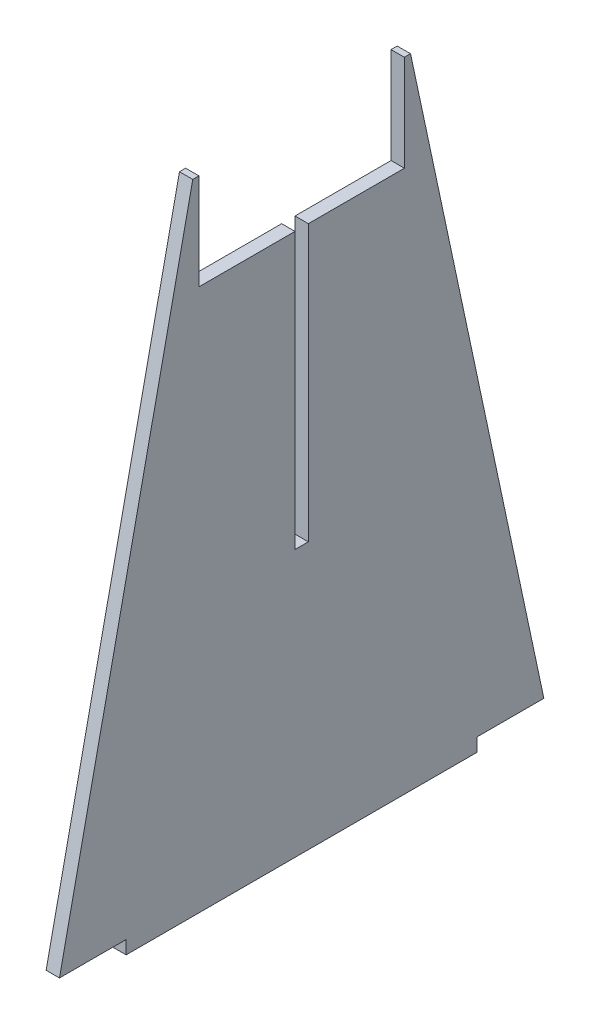
ISO-10303-21;
HEADER;
FILE_DESCRIPTION(('STEP AP214'),'2;1');
FILE_NAME('part.step','',(''),(''),'','','');
FILE_SCHEMA(('AUTOMOTIVE_DESIGN { 1 0 10303 214 1 1 1 1 }'));
ENDSEC;
DATA;
#1=APPLICATION_CONTEXT('core data for automotive mechanical design processes');
#2=APPLICATION_PROTOCOL_DEFINITION('international standard','automotive_design',2000,#1);
#3=PRODUCT_CONTEXT('',#1,'mechanical');
#4=PRODUCT('Part','Part','',(#3));
#5=PRODUCT_RELATED_PRODUCT_CATEGORY('part','',(#4));
#6=PRODUCT_DEFINITION_FORMATION('','',#4);
#7=PRODUCT_DEFINITION_CONTEXT('part definition',#1,'design');
#8=PRODUCT_DEFINITION('design','',#6,#7);
#9=PRODUCT_DEFINITION_SHAPE('','',#8);
#10=(LENGTH_UNIT() NAMED_UNIT(*) SI_UNIT(.MILLI.,.METRE.));
#11=(NAMED_UNIT(*) PLANE_ANGLE_UNIT() SI_UNIT($,.RADIAN.));
#12=(NAMED_UNIT(*) SI_UNIT($,.STERADIAN.) SOLID_ANGLE_UNIT());
#13=UNCERTAINTY_MEASURE_WITH_UNIT(LENGTH_MEASURE(1.E-05),#10,'distance_accuracy_value','');
#14=(GEOMETRIC_REPRESENTATION_CONTEXT(3) GLOBAL_UNCERTAINTY_ASSIGNED_CONTEXT((#13)) GLOBAL_UNIT_ASSIGNED_CONTEXT((#10,
#11,#12)) REPRESENTATION_CONTEXT('',''));
#15=CARTESIAN_POINT('',(0.,0.,0.));
#16=DIRECTION('',(0.,0.,1.));
#17=DIRECTION('',(1.,0.,0.));
#18=AXIS2_PLACEMENT_3D('',#15,#16,#17);
#19=CARTESIAN_POINT('',(3.,119.,1.5));
#20=DIRECTION('',(0.,-1.,0.));
#21=DIRECTION('',(0.,0.,-1.));
#22=AXIS2_PLACEMENT_3D('',#19,#20,#21);
#23=PLANE('',#22);
#24=DIRECTION('',(1.,0.,0.));
#25=VECTOR('',#24,1.);
#26=CARTESIAN_POINT('',(-22.4419389759441,119.,23.1133333333333));
#27=LINE('',#26,#25);
#28=CARTESIAN_POINT('',(0.,119.,23.1133333333333));
#29=VERTEX_POINT('',#28);
#30=CARTESIAN_POINT('',(3.,119.,23.1133333333333));
#31=VERTEX_POINT('',#30);
#32=EDGE_CURVE('E66',#29,#31,#27,.T.);
#33=ORIENTED_EDGE('',*,*,#32,.T.);
#34=DIRECTION('',(0.,0.,1.));
#35=VECTOR('',#34,1.);
#36=CARTESIAN_POINT('',(3.,119.,1.5));
#37=LINE('',#36,#35);
#38=CARTESIAN_POINT('',(3.,119.,1.5));
#39=VERTEX_POINT('',#38);
#40=EDGE_CURVE('E222',#39,#31,#37,.T.);
#41=ORIENTED_EDGE('',*,*,#40,.F.);
#42=DIRECTION('',(-1.,0.,0.));
#43=VECTOR('',#42,1.);
#44=CARTESIAN_POINT('',(3.,119.,1.5));
#45=LINE('',#44,#43);
#46=CARTESIAN_POINT('',(0.,119.,1.5));
#47=VERTEX_POINT('',#46);
#48=EDGE_CURVE('E268',#39,#47,#45,.T.);
#49=ORIENTED_EDGE('',*,*,#48,.T.);
#50=DIRECTION('',(0.,0.,1.));
#51=VECTOR('',#50,1.);
#52=CARTESIAN_POINT('',(0.,119.,1.5));
#53=LINE('',#52,#51);
#54=EDGE_CURVE('E243',#47,#29,#53,.T.);
#55=ORIENTED_EDGE('',*,*,#54,.T.);
#56=EDGE_LOOP('',(#33,#41,#49,#55));
#57=FACE_BOUND('',#56,.T.);
#58=ADVANCED_FACE('F43',(#57),#23,.F.);
#59=CARTESIAN_POINT('',(3.,0.,-54.5));
#60=DIRECTION('',(0.,1.,0.));
#61=DIRECTION('',(0.,0.,1.));
#62=AXIS2_PLACEMENT_3D('',#59,#60,#61);
#63=PLANE('',#62);
#64=DIRECTION('',(0.,0.,-1.));
#65=VECTOR('',#64,1.);
#66=CARTESIAN_POINT('',(0.,0.,-54.5));
#67=LINE('',#66,#65);
#68=CARTESIAN_POINT('',(0.,0.,-39.5));
#69=VERTEX_POINT('',#68);
#70=CARTESIAN_POINT('',(0.,0.,-54.5));
#71=VERTEX_POINT('',#70);
#72=EDGE_CURVE('E168',#69,#71,#67,.T.);
#73=ORIENTED_EDGE('',*,*,#72,.T.);
#74=DIRECTION('',(-1.,0.,0.));
#75=VECTOR('',#74,1.);
#76=CARTESIAN_POINT('',(3.,0.,-54.5));
#77=LINE('',#76,#75);
#78=CARTESIAN_POINT('',(3.,0.,-54.5));
#79=VERTEX_POINT('',#78);
#80=EDGE_CURVE('E11',#79,#71,#77,.T.);
#81=ORIENTED_EDGE('',*,*,#80,.F.);
#82=DIRECTION('',(0.,0.,-1.));
#83=VECTOR('',#82,1.);
#84=CARTESIAN_POINT('',(3.,0.,-54.5));
#85=LINE('',#84,#83);
#86=CARTESIAN_POINT('',(3.,0.,-39.5));
#87=VERTEX_POINT('',#86);
#88=EDGE_CURVE('E209',#87,#79,#85,.T.);
#89=ORIENTED_EDGE('',*,*,#88,.F.);
#90=DIRECTION('',(-1.,0.,0.));
#91=VECTOR('',#90,1.);
#92=CARTESIAN_POINT('',(3.,0.,-39.5));
#93=LINE('',#92,#91);
#94=EDGE_CURVE('E234',#87,#69,#93,.T.);
#95=ORIENTED_EDGE('',*,*,#94,.T.);
#96=EDGE_LOOP('',(#73,#81,#89,#95));
#97=FACE_BOUND('',#96,.T.);
#98=ADVANCED_FACE('F45',(#97),#63,.F.);
#99=CARTESIAN_POINT('',(3.,119.,-29.1133333333333));
#100=DIRECTION('',(0.,-0.208638471770519,0.977992836424307));
#101=DIRECTION('',(0.,-0.977992836424308,-0.208638471770519));
#102=AXIS2_PLACEMENT_3D('',#99,#100,#101);
#103=PLANE('',#102);
#104=DIRECTION('',(0.,0.977992836424308,0.208638471770519));
#105=VECTOR('',#104,1.);
#106=CARTESIAN_POINT('',(0.,119.,-29.1133333333333));
#107=LINE('',#106,#105);
#108=CARTESIAN_POINT('',(0.,140.625,-24.5));
#109=VERTEX_POINT('',#108);
#110=EDGE_CURVE('E157',#71,#109,#107,.T.);
#111=ORIENTED_EDGE('',*,*,#110,.T.);
#112=DIRECTION('',(1.,0.,0.));
#113=VECTOR('',#112,1.);
#114=CARTESIAN_POINT('',(-22.4419389759441,140.625,-24.5));
#115=LINE('',#114,#113);
#116=CARTESIAN_POINT('',(3.,140.625,-24.5));
#117=VERTEX_POINT('',#116);
#118=EDGE_CURVE('E161',#109,#117,#115,.T.);
#119=ORIENTED_EDGE('',*,*,#118,.T.);
#120=DIRECTION('',(0.,0.977992836424308,0.208638471770519));
#121=VECTOR('',#120,1.);
#122=CARTESIAN_POINT('',(3.,119.,-29.1133333333333));
#123=LINE('',#122,#121);
#124=EDGE_CURVE('E212',#79,#117,#123,.T.);
#125=ORIENTED_EDGE('',*,*,#124,.F.);
#126=ORIENTED_EDGE('',*,*,#80,.T.);
#127=EDGE_LOOP('',(#111,#119,#125,#126));
#128=FACE_BOUND('',#127,.T.);
#129=ADVANCED_FACE('F159',(#128),#103,.F.);
#130=CARTESIAN_POINT('',(3.,119.,-29.1133333333333));
#131=DIRECTION('',(0.,-1.,0.));
#132=DIRECTION('',(0.,0.,-1.));
#133=AXIS2_PLACEMENT_3D('',#130,#131,#132);
#134=PLANE('',#133);
#135=DIRECTION('',(0.,0.,1.));
#136=VECTOR('',#135,1.);
#137=CARTESIAN_POINT('',(3.,119.,-29.1133333333333));
#138=LINE('',#137,#136);
#139=CARTESIAN_POINT('',(3.,119.,-23.1133333333333));
#140=VERTEX_POINT('',#139);
#141=CARTESIAN_POINT('',(3.,119.,-1.5));
#142=VERTEX_POINT('',#141);
#143=EDGE_CURVE('E58',#140,#142,#138,.T.);
#144=ORIENTED_EDGE('',*,*,#143,.F.);
#145=DIRECTION('',(1.,0.,0.));
#146=VECTOR('',#145,1.);
#147=CARTESIAN_POINT('',(-22.4419389759441,119.,-23.1133333333333));
#148=LINE('',#147,#146);
#149=CARTESIAN_POINT('',(0.,119.,-23.1133333333333));
#150=VERTEX_POINT('',#149);
#151=EDGE_CURVE('E181',#150,#140,#148,.T.);
#152=ORIENTED_EDGE('',*,*,#151,.F.);
#153=DIRECTION('',(0.,0.,1.));
#154=VECTOR('',#153,1.);
#155=CARTESIAN_POINT('',(0.,119.,-29.1133333333333));
#156=LINE('',#155,#154);
#157=CARTESIAN_POINT('',(0.,119.,-1.5));
#158=VERTEX_POINT('',#157);
#159=EDGE_CURVE('E167',#150,#158,#156,.T.);
#160=ORIENTED_EDGE('',*,*,#159,.T.);
#161=DIRECTION('',(-1.,0.,0.));
#162=VECTOR('',#161,1.);
#163=CARTESIAN_POINT('',(3.,119.,-1.5));
#164=LINE('',#163,#162);
#165=EDGE_CURVE('E51',#142,#158,#164,.T.);
#166=ORIENTED_EDGE('',*,*,#165,.F.);
#167=EDGE_LOOP('',(#144,#152,#160,#166));
#168=FACE_BOUND('',#167,.T.);
#169=ADVANCED_FACE('F299',(#168),#134,.F.);
#170=CARTESIAN_POINT('',(3.,57.,-1.50000000000002));
#171=DIRECTION('',(0.,0.,-1.));
#172=DIRECTION('',(0.,1.,0.));
#173=AXIS2_PLACEMENT_3D('',#170,#171,#172);
#174=PLANE('',#173);
#175=DIRECTION('',(0.,-1.,0.));
#176=VECTOR('',#175,1.);
#177=CARTESIAN_POINT('',(0.,57.,-1.50000000000002));
#178=LINE('',#177,#176);
#179=CARTESIAN_POINT('',(0.,57.,-1.50000000000002));
#180=VERTEX_POINT('',#179);
#181=EDGE_CURVE('E237',#158,#180,#178,.T.);
#182=ORIENTED_EDGE('',*,*,#181,.T.);
#183=DIRECTION('',(-1.,0.,0.));
#184=VECTOR('',#183,1.);
#185=CARTESIAN_POINT('',(3.,57.,-1.50000000000002));
#186=LINE('',#185,#184);
#187=CARTESIAN_POINT('',(3.,57.,-1.50000000000002));
#188=VERTEX_POINT('',#187);
#189=EDGE_CURVE('E274',#188,#180,#186,.T.);
#190=ORIENTED_EDGE('',*,*,#189,.F.);
#191=DIRECTION('',(0.,-1.,0.));
#192=VECTOR('',#191,1.);
#193=CARTESIAN_POINT('',(3.,57.,-1.50000000000002));
#194=LINE('',#193,#192);
#195=EDGE_CURVE('E216',#142,#188,#194,.T.);
#196=ORIENTED_EDGE('',*,*,#195,.F.);
#197=ORIENTED_EDGE('',*,*,#165,.T.);
#198=EDGE_LOOP('',(#182,#190,#196,#197));
#199=FACE_BOUND('',#198,.T.);
#200=ADVANCED_FACE('F280',(#199),#174,.F.);
#201=CARTESIAN_POINT('',(3.,57.,-1.50000000000002));
#202=DIRECTION('',(0.,-1.,0.));
#203=DIRECTION('',(0.,0.,-1.));
#204=AXIS2_PLACEMENT_3D('',#201,#202,#203);
#205=PLANE('',#204);
#206=DIRECTION('',(0.,0.,1.));
#207=VECTOR('',#206,1.);
#208=CARTESIAN_POINT('',(0.,57.,-1.50000000000002));
#209=LINE('',#208,#207);
#210=CARTESIAN_POINT('',(0.,57.,1.5));
#211=VERTEX_POINT('',#210);
#212=EDGE_CURVE('E239',#180,#211,#209,.T.);
#213=ORIENTED_EDGE('',*,*,#212,.T.);
#214=DIRECTION('',(-1.,0.,0.));
#215=VECTOR('',#214,1.);
#216=CARTESIAN_POINT('',(3.,57.,1.5));
#217=LINE('',#216,#215);
#218=CARTESIAN_POINT('',(3.,57.,1.5));
#219=VERTEX_POINT('',#218);
#220=EDGE_CURVE('E271',#219,#211,#217,.T.);
#221=ORIENTED_EDGE('',*,*,#220,.F.);
#222=DIRECTION('',(0.,0.,1.));
#223=VECTOR('',#222,1.);
#224=CARTESIAN_POINT('',(3.,57.,-1.50000000000002));
#225=LINE('',#224,#223);
#226=EDGE_CURVE('E218',#188,#219,#225,.T.);
#227=ORIENTED_EDGE('',*,*,#226,.F.);
#228=ORIENTED_EDGE('',*,*,#189,.T.);
#229=EDGE_LOOP('',(#213,#221,#227,#228));
#230=FACE_BOUND('',#229,.T.);
#231=ADVANCED_FACE('F287',(#230),#205,.F.);
#232=CARTESIAN_POINT('',(3.,57.,1.5));
#233=DIRECTION('',(0.,0.,1.));
#234=DIRECTION('',(0.,-1.,0.));
#235=AXIS2_PLACEMENT_3D('',#232,#233,#234);
#236=PLANE('',#235);
#237=DIRECTION('',(0.,1.,0.));
#238=VECTOR('',#237,1.);
#239=CARTESIAN_POINT('',(0.,57.,1.5));
#240=LINE('',#239,#238);
#241=EDGE_CURVE('E241',#211,#47,#240,.T.);
#242=ORIENTED_EDGE('',*,*,#241,.T.);
#243=ORIENTED_EDGE('',*,*,#48,.F.);
#244=DIRECTION('',(0.,1.,0.));
#245=VECTOR('',#244,1.);
#246=CARTESIAN_POINT('',(3.,57.,1.5));
#247=LINE('',#246,#245);
#248=EDGE_CURVE('E220',#219,#39,#247,.T.);
#249=ORIENTED_EDGE('',*,*,#248,.F.);
#250=ORIENTED_EDGE('',*,*,#220,.T.);
#251=EDGE_LOOP('',(#242,#243,#249,#250));
#252=FACE_BOUND('',#251,.T.);
#253=ADVANCED_FACE('F291',(#252),#236,.F.);
#254=CARTESIAN_POINT('',(3.,119.,29.1133333333333));
#255=DIRECTION('',(0.,-0.208638471770519,-0.977992836424307));
#256=DIRECTION('',(0.,0.977992836424308,-0.208638471770519));
#257=AXIS2_PLACEMENT_3D('',#254,#255,#256);
#258=PLANE('',#257);
#259=DIRECTION('',(0.,-0.977992836424308,0.208638471770519));
#260=VECTOR('',#259,1.);
#261=CARTESIAN_POINT('',(0.,119.,29.1133333333333));
#262=LINE('',#261,#260);
#263=CARTESIAN_POINT('',(0.,140.625,24.5));
#264=VERTEX_POINT('',#263);
#265=CARTESIAN_POINT('',(0.,0.,54.5));
#266=VERTEX_POINT('',#265);
#267=EDGE_CURVE('E245',#264,#266,#262,.T.);
#268=ORIENTED_EDGE('',*,*,#267,.T.);
#269=DIRECTION('',(-1.,0.,0.));
#270=VECTOR('',#269,1.);
#271=CARTESIAN_POINT('',(3.,0.,54.5));
#272=LINE('',#271,#270);
#273=CARTESIAN_POINT('',(3.,0.,54.5));
#274=VERTEX_POINT('',#273);
#275=EDGE_CURVE('E265',#274,#266,#272,.T.);
#276=ORIENTED_EDGE('',*,*,#275,.F.);
#277=DIRECTION('',(0.,-0.977992836424308,0.208638471770519));
#278=VECTOR('',#277,1.);
#279=CARTESIAN_POINT('',(3.,119.,29.1133333333333));
#280=LINE('',#279,#278);
#281=CARTESIAN_POINT('',(3.,140.625,24.5));
#282=VERTEX_POINT('',#281);
#283=EDGE_CURVE('E224',#282,#274,#280,.T.);
#284=ORIENTED_EDGE('',*,*,#283,.F.);
#285=DIRECTION('',(1.,0.,0.));
#286=VECTOR('',#285,1.);
#287=CARTESIAN_POINT('',(-22.4419389759441,140.625,24.5));
#288=LINE('',#287,#286);
#289=EDGE_CURVE('E204',#264,#282,#288,.T.);
#290=ORIENTED_EDGE('',*,*,#289,.F.);
#291=EDGE_LOOP('',(#268,#276,#284,#290));
#292=FACE_BOUND('',#291,.T.);
#293=ADVANCED_FACE('F318',(#292),#258,.F.);
#294=CARTESIAN_POINT('',(3.,0.,54.5));
#295=DIRECTION('',(0.,1.,0.));
#296=DIRECTION('',(0.,0.,1.));
#297=AXIS2_PLACEMENT_3D('',#294,#295,#296);
#298=PLANE('',#297);
#299=DIRECTION('',(0.,0.,-1.));
#300=VECTOR('',#299,1.);
#301=CARTESIAN_POINT('',(0.,0.,54.5));
#302=LINE('',#301,#300);
#303=CARTESIAN_POINT('',(0.,0.,39.5));
#304=VERTEX_POINT('',#303);
#305=EDGE_CURVE('E247',#266,#304,#302,.T.);
#306=ORIENTED_EDGE('',*,*,#305,.T.);
#307=DIRECTION('',(-1.,0.,0.));
#308=VECTOR('',#307,1.);
#309=CARTESIAN_POINT('',(3.,0.,39.5));
#310=LINE('',#309,#308);
#311=CARTESIAN_POINT('',(3.,0.,39.5));
#312=VERTEX_POINT('',#311);
#313=EDGE_CURVE('E262',#312,#304,#310,.T.);
#314=ORIENTED_EDGE('',*,*,#313,.F.);
#315=DIRECTION('',(0.,0.,-1.));
#316=VECTOR('',#315,1.);
#317=CARTESIAN_POINT('',(3.,0.,54.5));
#318=LINE('',#317,#316);
#319=EDGE_CURVE('E226',#274,#312,#318,.T.);
#320=ORIENTED_EDGE('',*,*,#319,.F.);
#321=ORIENTED_EDGE('',*,*,#275,.T.);
#322=EDGE_LOOP('',(#306,#314,#320,#321));
#323=FACE_BOUND('',#322,.T.);
#324=ADVANCED_FACE('F335',(#323),#298,.F.);
#325=CARTESIAN_POINT('',(3.,0.,39.5));
#326=DIRECTION('',(0.,0.,-1.));
#327=DIRECTION('',(-1.,0.,0.));
#328=AXIS2_PLACEMENT_3D('',#325,#326,#327);
#329=PLANE('',#328);
#330=DIRECTION('',(0.,-1.,0.));
#331=VECTOR('',#330,1.);
#332=CARTESIAN_POINT('',(0.,0.,39.5));
#333=LINE('',#332,#331);
#334=CARTESIAN_POINT('',(0.,-3.,39.5));
#335=VERTEX_POINT('',#334);
#336=EDGE_CURVE('E249',#304,#335,#333,.T.);
#337=ORIENTED_EDGE('',*,*,#336,.T.);
#338=DIRECTION('',(-1.,0.,0.));
#339=VECTOR('',#338,1.);
#340=CARTESIAN_POINT('',(3.,-3.,39.5));
#341=LINE('',#340,#339);
#342=CARTESIAN_POINT('',(3.,-3.,39.5));
#343=VERTEX_POINT('',#342);
#344=EDGE_CURVE('E259',#343,#335,#341,.T.);
#345=ORIENTED_EDGE('',*,*,#344,.F.);
#346=DIRECTION('',(0.,-1.,0.));
#347=VECTOR('',#346,1.);
#348=CARTESIAN_POINT('',(3.,0.,39.5));
#349=LINE('',#348,#347);
#350=EDGE_CURVE('E228',#312,#343,#349,.T.);
#351=ORIENTED_EDGE('',*,*,#350,.F.);
#352=ORIENTED_EDGE('',*,*,#313,.T.);
#353=EDGE_LOOP('',(#337,#345,#351,#352));
#354=FACE_BOUND('',#353,.T.);
#355=ADVANCED_FACE('F338',(#354),#329,.F.);
#356=CARTESIAN_POINT('',(3.,-3.,-39.5));
#357=DIRECTION('',(0.,1.,0.));
#358=DIRECTION('',(0.,0.,1.));
#359=AXIS2_PLACEMENT_3D('',#356,#357,#358);
#360=PLANE('',#359);
#361=DIRECTION('',(0.,0.,-1.));
#362=VECTOR('',#361,1.);
#363=CARTESIAN_POINT('',(0.,-3.,-39.5));
#364=LINE('',#363,#362);
#365=CARTESIAN_POINT('',(0.,-3.,-39.5));
#366=VERTEX_POINT('',#365);
#367=EDGE_CURVE('E251',#335,#366,#364,.T.);
#368=ORIENTED_EDGE('',*,*,#367,.T.);
#369=DIRECTION('',(-1.,0.,0.));
#370=VECTOR('',#369,1.);
#371=CARTESIAN_POINT('',(3.,-3.,-39.5));
#372=LINE('',#371,#370);
#373=CARTESIAN_POINT('',(3.,-3.,-39.5));
#374=VERTEX_POINT('',#373);
#375=EDGE_CURVE('E256',#374,#366,#372,.T.);
#376=ORIENTED_EDGE('',*,*,#375,.F.);
#377=DIRECTION('',(0.,0.,-1.));
#378=VECTOR('',#377,1.);
#379=CARTESIAN_POINT('',(3.,-3.,-39.5));
#380=LINE('',#379,#378);
#381=EDGE_CURVE('E230',#343,#374,#380,.T.);
#382=ORIENTED_EDGE('',*,*,#381,.F.);
#383=ORIENTED_EDGE('',*,*,#344,.T.);
#384=EDGE_LOOP('',(#368,#376,#382,#383));
#385=FACE_BOUND('',#384,.T.);
#386=ADVANCED_FACE('F345',(#385),#360,.F.);
#387=CARTESIAN_POINT('',(3.,0.,-39.5));
#388=DIRECTION('',(0.,0.,1.));
#389=DIRECTION('',(1.,0.,0.));
#390=AXIS2_PLACEMENT_3D('',#387,#388,#389);
#391=PLANE('',#390);
#392=DIRECTION('',(0.,1.,0.));
#393=VECTOR('',#392,1.);
#394=CARTESIAN_POINT('',(0.,0.,-39.5));
#395=LINE('',#394,#393);
#396=EDGE_CURVE('E213',#366,#69,#395,.T.);
#397=ORIENTED_EDGE('',*,*,#396,.T.);
#398=ORIENTED_EDGE('',*,*,#94,.F.);
#399=DIRECTION('',(0.,1.,0.));
#400=VECTOR('',#399,1.);
#401=CARTESIAN_POINT('',(3.,0.,-39.5));
#402=LINE('',#401,#400);
#403=EDGE_CURVE('E232',#374,#87,#402,.T.);
#404=ORIENTED_EDGE('',*,*,#403,.F.);
#405=ORIENTED_EDGE('',*,*,#375,.T.);
#406=EDGE_LOOP('',(#397,#398,#404,#405));
#407=FACE_BOUND('',#406,.T.);
#408=ADVANCED_FACE('F353',(#407),#391,.F.);
#409=CARTESIAN_POINT('',(3.,0.,0.));
#410=DIRECTION('',(1.,0.,0.));
#411=DIRECTION('',(0.,0.,-1.));
#412=AXIS2_PLACEMENT_3D('',#409,#410,#411);
#413=PLANE('',#412);
#414=ORIENTED_EDGE('',*,*,#88,.T.);
#415=ORIENTED_EDGE('',*,*,#124,.T.);
#416=DIRECTION('',(0.,0.,1.));
#417=VECTOR('',#416,1.);
#418=CARTESIAN_POINT('',(3.,140.625,-24.5));
#419=LINE('',#418,#417);
#420=CARTESIAN_POINT('',(3.,140.625,-23.1133333333333));
#421=VERTEX_POINT('',#420);
#422=EDGE_CURVE('E180',#117,#421,#419,.T.);
#423=ORIENTED_EDGE('',*,*,#422,.T.);
#424=DIRECTION('',(0.,-1.,0.));
#425=VECTOR('',#424,1.);
#426=CARTESIAN_POINT('',(3.,140.625,-23.1133333333333));
#427=LINE('',#426,#425);
#428=EDGE_CURVE('E187',#421,#140,#427,.T.);
#429=ORIENTED_EDGE('',*,*,#428,.T.);
#430=ORIENTED_EDGE('',*,*,#143,.T.);
#431=ORIENTED_EDGE('',*,*,#195,.T.);
#432=ORIENTED_EDGE('',*,*,#226,.T.);
#433=ORIENTED_EDGE('',*,*,#248,.T.);
#434=ORIENTED_EDGE('',*,*,#40,.T.);
#435=DIRECTION('',(0.,-1.,0.));
#436=VECTOR('',#435,1.);
#437=CARTESIAN_POINT('',(3.,140.625,23.1133333333333));
#438=LINE('',#437,#436);
#439=CARTESIAN_POINT('',(3.,140.625,23.1133333333333));
#440=VERTEX_POINT('',#439);
#441=EDGE_CURVE('E201',#440,#31,#438,.T.);
#442=ORIENTED_EDGE('',*,*,#441,.F.);
#443=DIRECTION('',(0.,0.,-1.));
#444=VECTOR('',#443,1.);
#445=CARTESIAN_POINT('',(3.,140.625,24.5));
#446=LINE('',#445,#444);
#447=EDGE_CURVE('E190',#282,#440,#446,.T.);
#448=ORIENTED_EDGE('',*,*,#447,.F.);
#449=ORIENTED_EDGE('',*,*,#283,.T.);
#450=ORIENTED_EDGE('',*,*,#319,.T.);
#451=ORIENTED_EDGE('',*,*,#350,.T.);
#452=ORIENTED_EDGE('',*,*,#381,.T.);
#453=ORIENTED_EDGE('',*,*,#403,.T.);
#454=EDGE_LOOP('',(#414,#415,#423,#429,#430,#431,#432,#433,#434,#442,#448,#449,#450,#451,#452,#453));
#455=FACE_BOUND('',#454,.T.);
#456=ADVANCED_FACE('F294',(#455),#413,.T.);
#457=CARTESIAN_POINT('',(0.,0.,0.));
#458=DIRECTION('',(1.,0.,0.));
#459=DIRECTION('',(0.,0.,-1.));
#460=AXIS2_PLACEMENT_3D('',#457,#458,#459);
#461=PLANE('',#460);
#462=ORIENTED_EDGE('',*,*,#72,.F.);
#463=ORIENTED_EDGE('',*,*,#396,.F.);
#464=ORIENTED_EDGE('',*,*,#367,.F.);
#465=ORIENTED_EDGE('',*,*,#336,.F.);
#466=ORIENTED_EDGE('',*,*,#305,.F.);
#467=ORIENTED_EDGE('',*,*,#267,.F.);
#468=DIRECTION('',(0.,0.,1.));
#469=VECTOR('',#468,1.);
#470=CARTESIAN_POINT('',(0.,140.625,24.5));
#471=LINE('',#470,#469);
#472=CARTESIAN_POINT('',(0.,140.625,23.1133333333333));
#473=VERTEX_POINT('',#472);
#474=EDGE_CURVE('E195',#473,#264,#471,.T.);
#475=ORIENTED_EDGE('',*,*,#474,.F.);
#476=DIRECTION('',(0.,1.,0.));
#477=VECTOR('',#476,1.);
#478=CARTESIAN_POINT('',(0.,140.625,23.1133333333333));
#479=LINE('',#478,#477);
#480=EDGE_CURVE('E192',#29,#473,#479,.T.);
#481=ORIENTED_EDGE('',*,*,#480,.F.);
#482=ORIENTED_EDGE('',*,*,#54,.F.);
#483=ORIENTED_EDGE('',*,*,#241,.F.);
#484=ORIENTED_EDGE('',*,*,#212,.F.);
#485=ORIENTED_EDGE('',*,*,#181,.F.);
#486=ORIENTED_EDGE('',*,*,#159,.F.);
#487=DIRECTION('',(0.,1.,0.));
#488=VECTOR('',#487,1.);
#489=CARTESIAN_POINT('',(0.,140.625,-23.1133333333333));
#490=LINE('',#489,#488);
#491=CARTESIAN_POINT('',(0.,140.625,-23.1133333333333));
#492=VERTEX_POINT('',#491);
#493=EDGE_CURVE('E174',#150,#492,#490,.T.);
#494=ORIENTED_EDGE('',*,*,#493,.T.);
#495=DIRECTION('',(0.,0.,-1.));
#496=VECTOR('',#495,1.);
#497=CARTESIAN_POINT('',(0.,140.625,-24.5));
#498=LINE('',#497,#496);
#499=EDGE_CURVE('E171',#492,#109,#498,.T.);
#500=ORIENTED_EDGE('',*,*,#499,.T.);
#501=ORIENTED_EDGE('',*,*,#110,.F.);
#502=EDGE_LOOP('',(#462,#463,#464,#465,#466,#467,#475,#481,#482,#483,#484,#485,#486,#494,#500,#501));
#503=FACE_BOUND('',#502,.T.);
#504=ADVANCED_FACE('F172',(#503),#461,.F.);
#505=CARTESIAN_POINT('',(-22.4419389759441,140.625,23.1133333333333));
#506=DIRECTION('',(0.,0.,1.));
#507=DIRECTION('',(0.,-1.,0.));
#508=AXIS2_PLACEMENT_3D('',#505,#506,#507);
#509=PLANE('',#508);
#510=ORIENTED_EDGE('',*,*,#32,.F.);
#511=ORIENTED_EDGE('',*,*,#480,.T.);
#512=DIRECTION('',(1.,0.,0.));
#513=VECTOR('',#512,1.);
#514=CARTESIAN_POINT('',(-22.4419389759441,140.625,23.1133333333333));
#515=LINE('',#514,#513);
#516=EDGE_CURVE('E196',#473,#440,#515,.T.);
#517=ORIENTED_EDGE('',*,*,#516,.T.);
#518=ORIENTED_EDGE('',*,*,#441,.T.);
#519=EDGE_LOOP('',(#510,#511,#517,#518));
#520=FACE_BOUND('',#519,.T.);
#521=ADVANCED_FACE('F387',(#520),#509,.F.);
#522=CARTESIAN_POINT('',(-22.4419389759441,140.625,24.5));
#523=DIRECTION('',(0.,-1.,0.));
#524=DIRECTION('',(0.,0.,-1.));
#525=AXIS2_PLACEMENT_3D('',#522,#523,#524);
#526=PLANE('',#525);
#527=ORIENTED_EDGE('',*,*,#516,.F.);
#528=ORIENTED_EDGE('',*,*,#474,.T.);
#529=ORIENTED_EDGE('',*,*,#289,.T.);
#530=ORIENTED_EDGE('',*,*,#447,.T.);
#531=EDGE_LOOP('',(#527,#528,#529,#530));
#532=FACE_BOUND('',#531,.T.);
#533=ADVANCED_FACE('F394',(#532),#526,.F.);
#534=CARTESIAN_POINT('',(-22.4419389759441,140.625,-24.5));
#535=DIRECTION('',(0.,1.,0.));
#536=DIRECTION('',(0.,0.,1.));
#537=AXIS2_PLACEMENT_3D('',#534,#535,#536);
#538=PLANE('',#537);
#539=ORIENTED_EDGE('',*,*,#499,.F.);
#540=DIRECTION('',(1.,0.,0.));
#541=VECTOR('',#540,1.);
#542=CARTESIAN_POINT('',(-22.4419389759441,140.625,-23.1133333333333));
#543=LINE('',#542,#541);
#544=EDGE_CURVE('E183',#492,#421,#543,.T.);
#545=ORIENTED_EDGE('',*,*,#544,.T.);
#546=ORIENTED_EDGE('',*,*,#422,.F.);
#547=ORIENTED_EDGE('',*,*,#118,.F.);
#548=EDGE_LOOP('',(#539,#545,#546,#547));
#549=FACE_BOUND('',#548,.T.);
#550=ADVANCED_FACE('F178',(#549),#538,.T.);
#551=CARTESIAN_POINT('',(-22.4419389759441,140.625,-23.1133333333333));
#552=DIRECTION('',(0.,0.,1.));
#553=DIRECTION('',(0.,-1.,0.));
#554=AXIS2_PLACEMENT_3D('',#551,#552,#553);
#555=PLANE('',#554);
#556=ORIENTED_EDGE('',*,*,#493,.F.);
#557=ORIENTED_EDGE('',*,*,#151,.T.);
#558=ORIENTED_EDGE('',*,*,#428,.F.);
#559=ORIENTED_EDGE('',*,*,#544,.F.);
#560=EDGE_LOOP('',(#556,#557,#558,#559));
#561=FACE_BOUND('',#560,.T.);
#562=ADVANCED_FACE('F298',(#561),#555,.T.);
#563=CLOSED_SHELL('',(#58,#98,#129,#169,#200,#231,#253,#293,#324,#355,#386,#408,#456,#504,#521,
#533,#550,#562));
#564=MANIFOLD_SOLID_BREP('B2',#563);
#565=ADVANCED_BREP_SHAPE_REPRESENTATION('',(#18,#564),#14);
#566=SHAPE_DEFINITION_REPRESENTATION(#9,#565);
ENDSEC;
END-ISO-10303-21;
